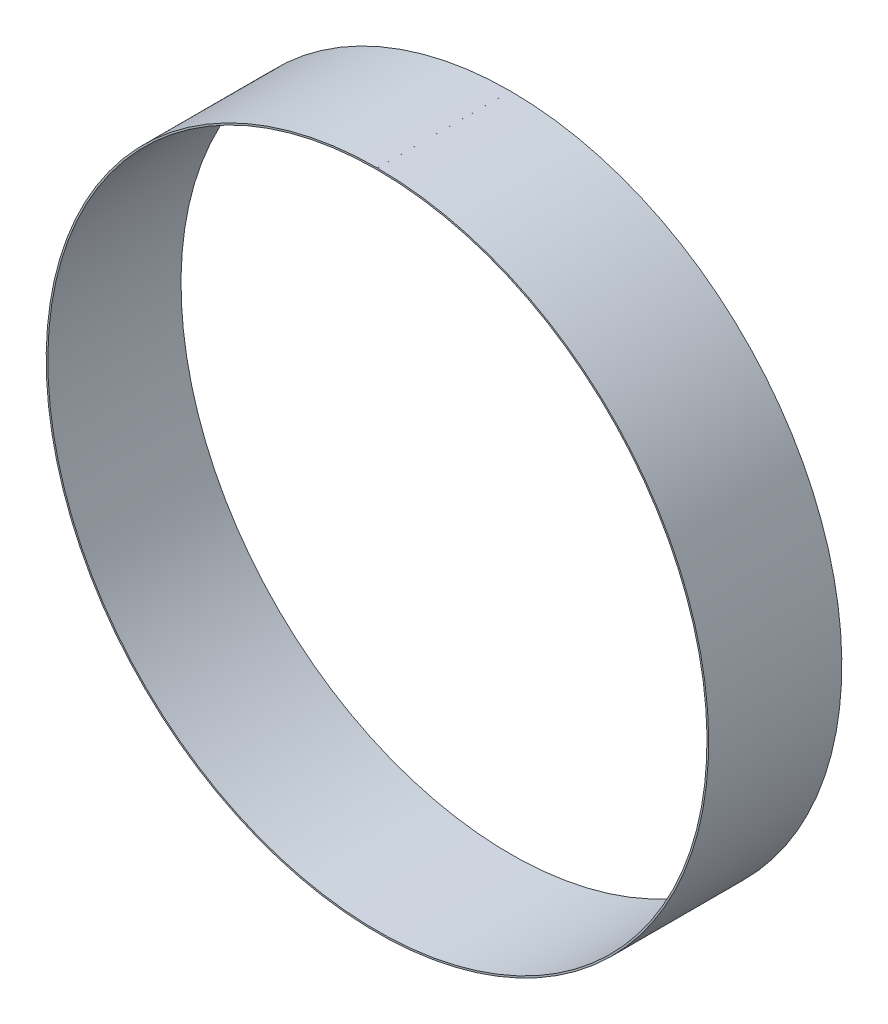
ISO-10303-21;
HEADER;
FILE_DESCRIPTION(('STEP AP214'),'2;1');
FILE_NAME('part.step','',(''),(''),'','','');
FILE_SCHEMA(('AUTOMOTIVE_DESIGN { 1 0 10303 214 1 1 1 1 }'));
ENDSEC;
DATA;
#1=APPLICATION_CONTEXT('core data for automotive mechanical design processes');
#2=APPLICATION_PROTOCOL_DEFINITION('international standard','automotive_design',2000,#1);
#3=PRODUCT_CONTEXT('',#1,'mechanical');
#4=PRODUCT('Part','Part','',(#3));
#5=PRODUCT_RELATED_PRODUCT_CATEGORY('part','',(#4));
#6=PRODUCT_DEFINITION_FORMATION('','',#4);
#7=PRODUCT_DEFINITION_CONTEXT('part definition',#1,'design');
#8=PRODUCT_DEFINITION('design','',#6,#7);
#9=PRODUCT_DEFINITION_SHAPE('','',#8);
#10=(LENGTH_UNIT() NAMED_UNIT(*) SI_UNIT(.MILLI.,.METRE.));
#11=(NAMED_UNIT(*) PLANE_ANGLE_UNIT() SI_UNIT($,.RADIAN.));
#12=(NAMED_UNIT(*) SI_UNIT($,.STERADIAN.) SOLID_ANGLE_UNIT());
#13=UNCERTAINTY_MEASURE_WITH_UNIT(LENGTH_MEASURE(1.E-05),#10,'distance_accuracy_value','');
#14=(GEOMETRIC_REPRESENTATION_CONTEXT(3) GLOBAL_UNCERTAINTY_ASSIGNED_CONTEXT((#13)) GLOBAL_UNIT_ASSIGNED_CONTEXT((#10,
#11,#12)) REPRESENTATION_CONTEXT('',''));
#15=CARTESIAN_POINT('',(0.,0.,0.));
#16=DIRECTION('',(0.,0.,1.));
#17=DIRECTION('',(1.,0.,0.));
#18=AXIS2_PLACEMENT_3D('',#15,#16,#17);
#19=CARTESIAN_POINT('',(64.75,146.66,331.5));
#20=DIRECTION('',(0.,0.,-1.));
#21=DIRECTION('',(-1.,0.,0.));
#22=AXIS2_PLACEMENT_3D('',#19,#20,#21);
#23=CYLINDRICAL_SURFACE('',#22,199.);
#24=CARTESIAN_POINT('',(64.75,146.66,251.5));
#25=DIRECTION('',(0.,0.,1.));
#26=DIRECTION('',(1.,0.,0.));
#27=AXIS2_PLACEMENT_3D('',#24,#25,#26);
#28=CIRCLE('',#27,199.);
#29=CARTESIAN_POINT('',(64.7449999993271,345.659999937186,251.5));
#30=VERTEX_POINT('',#29);
#31=CARTESIAN_POINT('',(64.7549999993262,345.659999937186,251.5));
#32=VERTEX_POINT('',#31);
#33=EDGE_CURVE('E203',#30,#32,#28,.T.);
#34=ORIENTED_EDGE('',*,*,#33,.T.);
#35=DIRECTION('',(0.,0.,-1.));
#36=VECTOR('',#35,1.);
#37=CARTESIAN_POINT('',(64.7549999993262,345.659999937186,331.5));
#38=LINE('',#37,#36);
#39=CARTESIAN_POINT('',(64.7549999993262,345.659999937186,331.5));
#40=VERTEX_POINT('',#39);
#41=EDGE_CURVE('E14',#40,#32,#38,.T.);
#42=ORIENTED_EDGE('',*,*,#41,.F.);
#43=CARTESIAN_POINT('',(64.75,146.66,331.5));
#44=DIRECTION('',(0.,0.,1.));
#45=DIRECTION('',(1.,0.,0.));
#46=AXIS2_PLACEMENT_3D('',#43,#44,#45);
#47=CIRCLE('',#46,199.);
#48=CARTESIAN_POINT('',(64.7449999993271,345.659999937186,331.5));
#49=VERTEX_POINT('',#48);
#50=EDGE_CURVE('E180',#49,#40,#47,.T.);
#51=ORIENTED_EDGE('',*,*,#50,.F.);
#52=DIRECTION('',(0.,0.,-1.));
#53=VECTOR('',#52,1.);
#54=CARTESIAN_POINT('',(64.7449999993271,345.659999937186,331.5));
#55=LINE('',#54,#53);
#56=EDGE_CURVE('E156',#49,#30,#55,.T.);
#57=ORIENTED_EDGE('',*,*,#56,.T.);
#58=EDGE_LOOP('',(#34,#42,#51,#57));
#59=FACE_BOUND('',#58,.T.);
#60=ADVANCED_FACE('F140',(#59),#23,.T.);
#61=CARTESIAN_POINT('',(64.7549748737015,344.659999937502,331.5));
#62=DIRECTION('',(-0.999999999684351,2.51256247474349E-05,0.));
#63=DIRECTION('',(-2.51256247474349E-05,-0.999999999684351,0.));
#64=AXIS2_PLACEMENT_3D('',#61,#62,#63);
#65=PLANE('',#64);
#66=DIRECTION('',(2.51256247474349E-05,0.999999999684351,0.));
#67=VECTOR('',#66,1.);
#68=CARTESIAN_POINT('',(64.7549748737015,344.659999937502,251.5));
#69=LINE('',#68,#67);
#70=CARTESIAN_POINT('',(64.7549748737015,344.659999937502,251.5));
#71=VERTEX_POINT('',#70);
#72=EDGE_CURVE('E189',#71,#32,#69,.T.);
#73=ORIENTED_EDGE('',*,*,#72,.F.);
#74=DIRECTION('',(0.,0.,-1.));
#75=VECTOR('',#74,1.);
#76=CARTESIAN_POINT('',(64.7549748737015,344.659999937502,331.5));
#77=LINE('',#76,#75);
#78=CARTESIAN_POINT('',(64.7549748737015,344.659999937502,331.5));
#79=VERTEX_POINT('',#78);
#80=EDGE_CURVE('E148',#79,#71,#77,.T.);
#81=ORIENTED_EDGE('',*,*,#80,.F.);
#82=DIRECTION('',(2.51256247474349E-05,0.999999999684351,0.));
#83=VECTOR('',#82,1.);
#84=CARTESIAN_POINT('',(64.7549748737015,344.659999937502,331.5));
#85=LINE('',#84,#83);
#86=EDGE_CURVE('E187',#79,#40,#85,.T.);
#87=ORIENTED_EDGE('',*,*,#86,.T.);
#88=ORIENTED_EDGE('',*,*,#41,.T.);
#89=EDGE_LOOP('',(#73,#81,#87,#88));
#90=FACE_BOUND('',#89,.T.);
#91=ADVANCED_FACE('F186',(#90),#65,.T.);
#92=CARTESIAN_POINT('',(64.75,146.66,331.5));
#93=DIRECTION('',(0.,0.,-1.));
#94=DIRECTION('',(-1.,0.,0.));
#95=AXIS2_PLACEMENT_3D('',#92,#93,#94);
#96=CYLINDRICAL_SURFACE('',#95,198.);
#97=CARTESIAN_POINT('',(64.75,146.66,251.5));
#98=DIRECTION('',(0.,0.,1.));
#99=DIRECTION('',(1.,0.,0.));
#100=AXIS2_PLACEMENT_3D('',#97,#98,#99);
#101=CIRCLE('',#100,198.);
#102=CARTESIAN_POINT('',(64.7450251249586,344.659999937502,251.5));
#103=VERTEX_POINT('',#102);
#104=EDGE_CURVE('E206',#103,#71,#101,.T.);
#105=ORIENTED_EDGE('',*,*,#104,.F.);
#106=DIRECTION('',(0.,0.,-1.));
#107=VECTOR('',#106,1.);
#108=CARTESIAN_POINT('',(64.7450251249586,344.659999937502,331.5));
#109=LINE('',#108,#107);
#110=CARTESIAN_POINT('',(64.7450251249586,344.659999937502,331.5));
#111=VERTEX_POINT('',#110);
#112=EDGE_CURVE('E169',#111,#103,#109,.T.);
#113=ORIENTED_EDGE('',*,*,#112,.F.);
#114=CARTESIAN_POINT('',(64.75,146.66,331.5));
#115=DIRECTION('',(0.,0.,1.));
#116=DIRECTION('',(1.,0.,0.));
#117=AXIS2_PLACEMENT_3D('',#114,#115,#116);
#118=CIRCLE('',#117,198.);
#119=EDGE_CURVE('E195',#111,#79,#118,.T.);
#120=ORIENTED_EDGE('',*,*,#119,.T.);
#121=ORIENTED_EDGE('',*,*,#80,.T.);
#122=EDGE_LOOP('',(#105,#113,#120,#121));
#123=FACE_BOUND('',#122,.T.);
#124=ADVANCED_FACE('F197',(#123),#96,.F.);
#125=CARTESIAN_POINT('',(64.7449999993271,345.659999937186,331.5));
#126=DIRECTION('',(0.999999999684351,2.51256315197953E-05,0.));
#127=DIRECTION('',(-2.51256315197953E-05,0.999999999684351,0.));
#128=AXIS2_PLACEMENT_3D('',#125,#126,#127);
#129=PLANE('',#128);
#130=DIRECTION('',(2.51256315197953E-05,-0.999999999684351,0.));
#131=VECTOR('',#130,1.);
#132=CARTESIAN_POINT('',(64.7449999993271,345.659999937186,251.5));
#133=LINE('',#132,#131);
#134=EDGE_CURVE('E208',#30,#103,#133,.T.);
#135=ORIENTED_EDGE('',*,*,#134,.F.);
#136=ORIENTED_EDGE('',*,*,#56,.F.);
#137=DIRECTION('',(2.51256315197953E-05,-0.999999999684351,0.));
#138=VECTOR('',#137,1.);
#139=CARTESIAN_POINT('',(64.7449999993271,345.659999937186,331.5));
#140=LINE('',#139,#138);
#141=EDGE_CURVE('E198',#49,#111,#140,.T.);
#142=ORIENTED_EDGE('',*,*,#141,.T.);
#143=ORIENTED_EDGE('',*,*,#112,.T.);
#144=EDGE_LOOP('',(#135,#136,#142,#143));
#145=FACE_BOUND('',#144,.T.);
#146=ADVANCED_FACE('F214',(#145),#129,.T.);
#147=CARTESIAN_POINT('',(64.75,146.66,331.5));
#148=DIRECTION('',(0.,0.,1.));
#149=DIRECTION('',(1.,0.,0.));
#150=AXIS2_PLACEMENT_3D('',#147,#148,#149);
#151=PLANE('',#150);
#152=ORIENTED_EDGE('',*,*,#50,.T.);
#153=ORIENTED_EDGE('',*,*,#86,.F.);
#154=ORIENTED_EDGE('',*,*,#119,.F.);
#155=ORIENTED_EDGE('',*,*,#141,.F.);
#156=EDGE_LOOP('',(#152,#153,#154,#155));
#157=FACE_BOUND('',#156,.T.);
#158=ADVANCED_FACE('F194',(#157),#151,.T.);
#159=CARTESIAN_POINT('',(64.75,146.66,251.5));
#160=DIRECTION('',(0.,0.,1.));
#161=DIRECTION('',(1.,0.,0.));
#162=AXIS2_PLACEMENT_3D('',#159,#160,#161);
#163=PLANE('',#162);
#164=ORIENTED_EDGE('',*,*,#33,.F.);
#165=ORIENTED_EDGE('',*,*,#134,.T.);
#166=ORIENTED_EDGE('',*,*,#104,.T.);
#167=ORIENTED_EDGE('',*,*,#72,.T.);
#168=EDGE_LOOP('',(#164,#165,#166,#167));
#169=FACE_BOUND('',#168,.T.);
#170=ADVANCED_FACE('F213',(#169),#163,.F.);
#171=CLOSED_SHELL('',(#60,#91,#124,#146,#158,#170));
#172=MANIFOLD_SOLID_BREP('B2',#171);
#173=ADVANCED_BREP_SHAPE_REPRESENTATION('',(#18,#172),#14);
#174=SHAPE_DEFINITION_REPRESENTATION(#9,#173);
ENDSEC;
END-ISO-10303-21;
